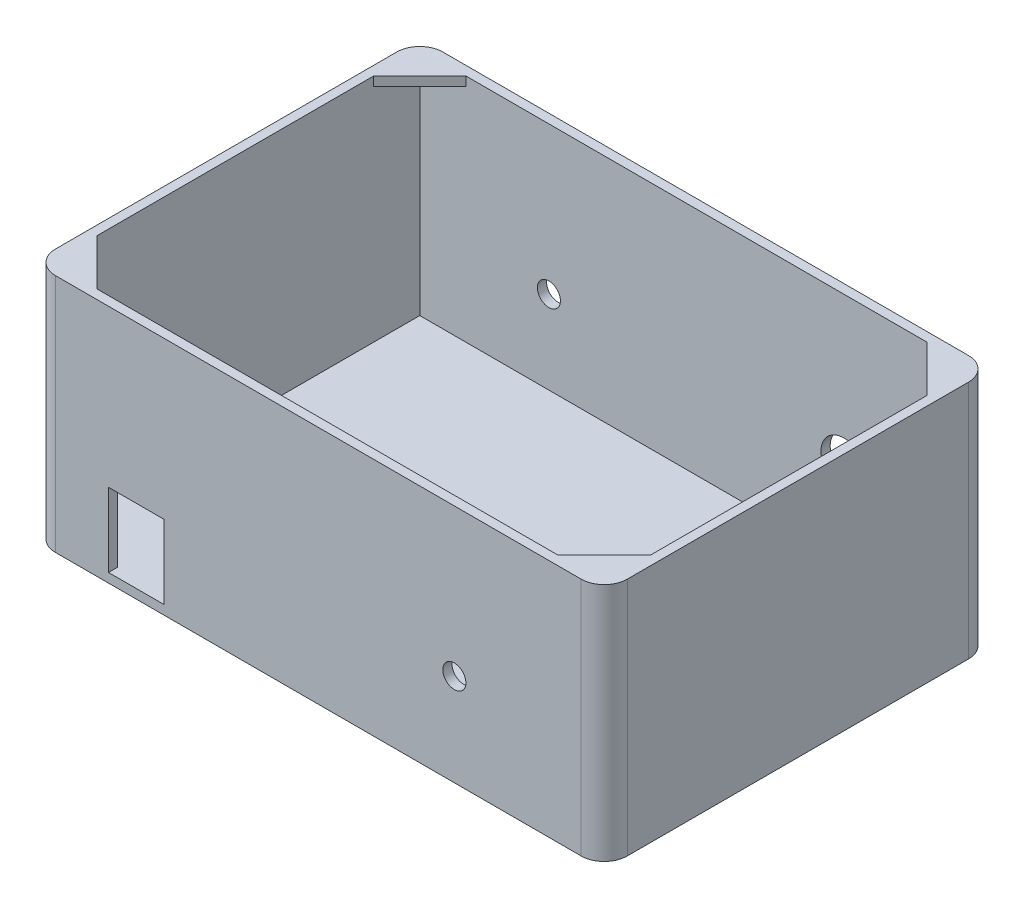
ISO-10303-21;
HEADER;
FILE_DESCRIPTION(('STEP AP214'),'2;1');
FILE_NAME('part.step','',(''),(''),'','','');
FILE_SCHEMA(('AUTOMOTIVE_DESIGN { 1 0 10303 214 1 1 1 1 }'));
ENDSEC;
DATA;
#1=APPLICATION_CONTEXT('core data for automotive mechanical design processes');
#2=APPLICATION_PROTOCOL_DEFINITION('international standard','automotive_design',2000,#1);
#3=PRODUCT_CONTEXT('',#1,'mechanical');
#4=PRODUCT('Part','Part','',(#3));
#5=PRODUCT_RELATED_PRODUCT_CATEGORY('part','',(#4));
#6=PRODUCT_DEFINITION_FORMATION('','',#4);
#7=PRODUCT_DEFINITION_CONTEXT('part definition',#1,'design');
#8=PRODUCT_DEFINITION('design','',#6,#7);
#9=PRODUCT_DEFINITION_SHAPE('','',#8);
#10=(LENGTH_UNIT() NAMED_UNIT(*) SI_UNIT(.MILLI.,.METRE.));
#11=(NAMED_UNIT(*) PLANE_ANGLE_UNIT() SI_UNIT($,.RADIAN.));
#12=(NAMED_UNIT(*) SI_UNIT($,.STERADIAN.) SOLID_ANGLE_UNIT());
#13=UNCERTAINTY_MEASURE_WITH_UNIT(LENGTH_MEASURE(1.E-05),#10,'distance_accuracy_value','');
#14=(GEOMETRIC_REPRESENTATION_CONTEXT(3) GLOBAL_UNCERTAINTY_ASSIGNED_CONTEXT((#13)) GLOBAL_UNIT_ASSIGNED_CONTEXT((#10,
#11,#12)) REPRESENTATION_CONTEXT('',''));
#15=CARTESIAN_POINT('',(0.,0.,0.));
#16=DIRECTION('',(0.,0.,1.));
#17=DIRECTION('',(1.,0.,0.));
#18=AXIS2_PLACEMENT_3D('',#15,#16,#17);
#19=CARTESIAN_POINT('',(0.,2.,0.));
#20=DIRECTION('',(0.,-1.,0.));
#21=DIRECTION('',(0.,0.,-1.));
#22=AXIS2_PLACEMENT_3D('',#19,#20,#21);
#23=PLANE('',#22);
#24=DIRECTION('',(1.,0.,0.));
#25=VECTOR('',#24,1.);
#26=CARTESIAN_POINT('',(-60.,2.,40.));
#27=LINE('',#26,#25);
#28=CARTESIAN_POINT('',(-60.,2.00000000000002,40.));
#29=VERTEX_POINT('',#28);
#30=CARTESIAN_POINT('',(-45.5,2.,40.));
#31=VERTEX_POINT('',#30);
#32=EDGE_CURVE('E398',#29,#31,#27,.T.);
#33=ORIENTED_EDGE('',*,*,#32,.T.);
#34=DIRECTION('',(0.,0.,1.));
#35=VECTOR('',#34,1.);
#36=CARTESIAN_POINT('',(-45.5,2.,40.));
#37=LINE('',#36,#35);
#38=CARTESIAN_POINT('',(-45.5,2.,42.));
#39=VERTEX_POINT('',#38);
#40=EDGE_CURVE('E213',#31,#39,#37,.T.);
#41=ORIENTED_EDGE('',*,*,#40,.T.);
#42=DIRECTION('',(1.,0.,0.));
#43=VECTOR('',#42,1.);
#44=CARTESIAN_POINT('',(-33.5,2.,42.));
#45=LINE('',#44,#43);
#46=CARTESIAN_POINT('',(-33.5,2.,42.));
#47=VERTEX_POINT('',#46);
#48=EDGE_CURVE('E307',#39,#47,#45,.T.);
#49=ORIENTED_EDGE('',*,*,#48,.T.);
#50=DIRECTION('',(0.,0.,1.));
#51=VECTOR('',#50,1.);
#52=CARTESIAN_POINT('',(-33.5,2.,40.));
#53=LINE('',#52,#51);
#54=CARTESIAN_POINT('',(-33.5,2.,40.));
#55=VERTEX_POINT('',#54);
#56=EDGE_CURVE('E324',#55,#47,#53,.T.);
#57=ORIENTED_EDGE('',*,*,#56,.F.);
#58=CARTESIAN_POINT('',(60.,2.,40.));
#59=VERTEX_POINT('',#58);
#60=EDGE_CURVE('E385',#55,#59,#27,.T.);
#61=ORIENTED_EDGE('',*,*,#60,.T.);
#62=DIRECTION('',(0.,0.,1.));
#63=VECTOR('',#62,1.);
#64=CARTESIAN_POINT('',(60.,2.,-40.));
#65=LINE('',#64,#63);
#66=CARTESIAN_POINT('',(60.,2.00000000000002,-40.));
#67=VERTEX_POINT('',#66);
#68=EDGE_CURVE('E402',#67,#59,#65,.T.);
#69=ORIENTED_EDGE('',*,*,#68,.F.);
#70=DIRECTION('',(1.,0.,0.));
#71=VECTOR('',#70,1.);
#72=CARTESIAN_POINT('',(-60.,2.,-40.));
#73=LINE('',#72,#71);
#74=CARTESIAN_POINT('',(-60.,2.00000000000002,-40.));
#75=VERTEX_POINT('',#74);
#76=EDGE_CURVE('E406',#75,#67,#73,.T.);
#77=ORIENTED_EDGE('',*,*,#76,.F.);
#78=DIRECTION('',(0.,0.,1.));
#79=VECTOR('',#78,1.);
#80=CARTESIAN_POINT('',(-60.,2.,-40.));
#81=LINE('',#80,#79);
#82=EDGE_CURVE('E410',#75,#29,#81,.T.);
#83=ORIENTED_EDGE('',*,*,#82,.T.);
#84=EDGE_LOOP('',(#33,#41,#49,#57,#61,#69,#77,#83));
#85=FACE_BOUND('',#84,.T.);
#86=ADVANCED_FACE('F39',(#85),#23,.F.);
#87=CARTESIAN_POINT('',(60.,52.,-40.));
#88=DIRECTION('',(-1.,0.,0.));
#89=DIRECTION('',(0.,0.,1.));
#90=AXIS2_PLACEMENT_3D('',#87,#88,#89);
#91=PLANE('',#90);
#92=DIRECTION('',(0.,1.,0.));
#93=VECTOR('',#92,1.);
#94=CARTESIAN_POINT('',(59.9999999999998,50.,-30.0000000000005));
#95=LINE('',#94,#93);
#96=CARTESIAN_POINT('',(60.,50.,-30.0000000000005));
#97=VERTEX_POINT('',#96);
#98=CARTESIAN_POINT('',(60.,52.,-30.0000000000005));
#99=VERTEX_POINT('',#98);
#100=EDGE_CURVE('E55',#97,#99,#95,.T.);
#101=ORIENTED_EDGE('',*,*,#100,.F.);
#102=DIRECTION('',(0.,0.,-1.));
#103=VECTOR('',#102,1.);
#104=CARTESIAN_POINT('',(59.9999999999998,50.,-30.0000000000005));
#105=LINE('',#104,#103);
#106=CARTESIAN_POINT('',(60.,50.,-40.));
#107=VERTEX_POINT('',#106);
#108=EDGE_CURVE('E698',#97,#107,#105,.T.);
#109=ORIENTED_EDGE('',*,*,#108,.T.);
#110=DIRECTION('',(0.,-1.,0.));
#111=VECTOR('',#110,1.);
#112=CARTESIAN_POINT('',(60.,52.,-40.));
#113=LINE('',#112,#111);
#114=EDGE_CURVE('E366',#107,#67,#113,.T.);
#115=ORIENTED_EDGE('',*,*,#114,.T.);
#116=ORIENTED_EDGE('',*,*,#68,.T.);
#117=DIRECTION('',(0.,-1.,0.));
#118=VECTOR('',#117,1.);
#119=CARTESIAN_POINT('',(60.,52.,40.));
#120=LINE('',#119,#118);
#121=CARTESIAN_POINT('',(60.,50.,40.));
#122=VERTEX_POINT('',#121);
#123=EDGE_CURVE('E357',#122,#59,#120,.T.);
#124=ORIENTED_EDGE('',*,*,#123,.F.);
#125=DIRECTION('',(0.,0.,-1.));
#126=VECTOR('',#125,1.);
#127=CARTESIAN_POINT('',(60.0000000000002,50.,29.9999999999996));
#128=LINE('',#127,#126);
#129=CARTESIAN_POINT('',(60.,50.,29.9999999999996));
#130=VERTEX_POINT('',#129);
#131=EDGE_CURVE('E220',#122,#130,#128,.T.);
#132=ORIENTED_EDGE('',*,*,#131,.T.);
#133=DIRECTION('',(0.,1.,0.));
#134=VECTOR('',#133,1.);
#135=CARTESIAN_POINT('',(60.0000000000002,50.,29.9999999999996));
#136=LINE('',#135,#134);
#137=CARTESIAN_POINT('',(60.0000000000002,52.,29.9999999999996));
#138=VERTEX_POINT('',#137);
#139=EDGE_CURVE('E216',#130,#138,#136,.T.);
#140=ORIENTED_EDGE('',*,*,#139,.T.);
#141=DIRECTION('',(0.,0.,-1.));
#142=VECTOR('',#141,1.);
#143=CARTESIAN_POINT('',(60.,52.,-40.));
#144=LINE('',#143,#142);
#145=EDGE_CURVE('E201',#138,#99,#144,.T.);
#146=ORIENTED_EDGE('',*,*,#145,.T.);
#147=EDGE_LOOP('',(#101,#109,#115,#116,#124,#132,#140,#146));
#148=FACE_BOUND('',#147,.T.);
#149=ADVANCED_FACE('F217',(#148),#91,.T.);
#150=CARTESIAN_POINT('',(-60.,52.,-40.));
#151=DIRECTION('',(0.,0.,1.));
#152=DIRECTION('',(1.,0.,0.));
#153=AXIS2_PLACEMENT_3D('',#150,#151,#152);
#154=PLANE('',#153);
#155=DIRECTION('',(0.,1.,0.));
#156=VECTOR('',#155,1.);
#157=CARTESIAN_POINT('',(49.9999999999997,50.,-40.0000000000005));
#158=LINE('',#157,#156);
#159=CARTESIAN_POINT('',(49.9999999999997,50.,-40.));
#160=VERTEX_POINT('',#159);
#161=CARTESIAN_POINT('',(49.9999999999997,52.,-40.));
#162=VERTEX_POINT('',#161);
#163=EDGE_CURVE('E232',#160,#162,#158,.T.);
#164=ORIENTED_EDGE('',*,*,#163,.T.);
#165=DIRECTION('',(-1.,0.,0.));
#166=VECTOR('',#165,1.);
#167=CARTESIAN_POINT('',(-60.,52.,-40.));
#168=LINE('',#167,#166);
#169=CARTESIAN_POINT('',(-50.,52.,-40.));
#170=VERTEX_POINT('',#169);
#171=EDGE_CURVE('E212',#162,#170,#168,.T.);
#172=ORIENTED_EDGE('',*,*,#171,.T.);
#173=DIRECTION('',(0.,1.,0.));
#174=VECTOR('',#173,1.);
#175=CARTESIAN_POINT('',(-50.,50.,-40.));
#176=LINE('',#175,#174);
#177=CARTESIAN_POINT('',(-50.,50.,-40.));
#178=VERTEX_POINT('',#177);
#179=EDGE_CURVE('E279',#178,#170,#176,.T.);
#180=ORIENTED_EDGE('',*,*,#179,.F.);
#181=DIRECTION('',(-1.,0.,0.));
#182=VECTOR('',#181,1.);
#183=CARTESIAN_POINT('',(-60.,50.,-40.));
#184=LINE('',#183,#182);
#185=CARTESIAN_POINT('',(-60.,50.,-40.));
#186=VERTEX_POINT('',#185);
#187=EDGE_CURVE('E265',#178,#186,#184,.T.);
#188=ORIENTED_EDGE('',*,*,#187,.T.);
#189=DIRECTION('',(0.,-1.,0.));
#190=VECTOR('',#189,1.);
#191=CARTESIAN_POINT('',(-60.,52.,-40.));
#192=LINE('',#191,#190);
#193=EDGE_CURVE('E363',#186,#75,#192,.T.);
#194=ORIENTED_EDGE('',*,*,#193,.T.);
#195=ORIENTED_EDGE('',*,*,#76,.T.);
#196=ORIENTED_EDGE('',*,*,#114,.F.);
#197=DIRECTION('',(-1.,0.,0.));
#198=VECTOR('',#197,1.);
#199=CARTESIAN_POINT('',(59.9999999999997,50.,-40.0000000000005));
#200=LINE('',#199,#198);
#201=EDGE_CURVE('E63',#107,#160,#200,.T.);
#202=ORIENTED_EDGE('',*,*,#201,.T.);
#203=EDGE_LOOP('',(#164,#172,#180,#188,#194,#195,#196,#202));
#204=FACE_BOUND('',#203,.T.);
#205=CARTESIAN_POINT('',(32.,20.,-40.));
#206=DIRECTION('',(0.,0.,-1.));
#207=DIRECTION('',(-1.,0.,0.));
#208=AXIS2_PLACEMENT_3D('',#205,#206,#207);
#209=CIRCLE('',#208,5.);
#210=CARTESIAN_POINT('',(27.,20.,-40.));
#211=VERTEX_POINT('',#210);
#212=EDGE_CURVE('E287',#211,#211,#209,.T.);
#213=ORIENTED_EDGE('',*,*,#212,.T.);
#214=EDGE_LOOP('',(#213));
#215=FACE_BOUND('',#214,.T.);
#216=CARTESIAN_POINT('',(-32.,20.,-40.));
#217=DIRECTION('',(0.,0.,-1.));
#218=DIRECTION('',(-1.,0.,0.));
#219=AXIS2_PLACEMENT_3D('',#216,#217,#218);
#220=CIRCLE('',#219,2.5);
#221=CARTESIAN_POINT('',(-34.5,20.,-40.));
#222=VERTEX_POINT('',#221);
#223=EDGE_CURVE('E296',#222,#222,#220,.T.);
#224=ORIENTED_EDGE('',*,*,#223,.T.);
#225=EDGE_LOOP('',(#224));
#226=FACE_BOUND('',#225,.T.);
#227=ADVANCED_FACE('F515',(#204,#215,#226),#154,.T.);
#228=CARTESIAN_POINT('',(-60.,52.,-40.));
#229=DIRECTION('',(1.,0.,0.));
#230=DIRECTION('',(0.,0.,-1.));
#231=AXIS2_PLACEMENT_3D('',#228,#229,#230);
#232=PLANE('',#231);
#233=DIRECTION('',(0.,1.,0.));
#234=VECTOR('',#233,1.);
#235=CARTESIAN_POINT('',(-60.,50.,30.));
#236=LINE('',#235,#234);
#237=CARTESIAN_POINT('',(-60.,50.,30.));
#238=VERTEX_POINT('',#237);
#239=CARTESIAN_POINT('',(-60.,52.,30.));
#240=VERTEX_POINT('',#239);
#241=EDGE_CURVE('E254',#238,#240,#236,.T.);
#242=ORIENTED_EDGE('',*,*,#241,.F.);
#243=DIRECTION('',(0.,0.,1.));
#244=VECTOR('',#243,1.);
#245=CARTESIAN_POINT('',(-60.,50.,30.));
#246=LINE('',#245,#244);
#247=CARTESIAN_POINT('',(-60.,50.,40.));
#248=VERTEX_POINT('',#247);
#249=EDGE_CURVE('E248',#238,#248,#246,.T.);
#250=ORIENTED_EDGE('',*,*,#249,.T.);
#251=DIRECTION('',(0.,-1.,0.));
#252=VECTOR('',#251,1.);
#253=CARTESIAN_POINT('',(-60.,52.,40.));
#254=LINE('',#253,#252);
#255=EDGE_CURVE('E360',#248,#29,#254,.T.);
#256=ORIENTED_EDGE('',*,*,#255,.T.);
#257=ORIENTED_EDGE('',*,*,#82,.F.);
#258=ORIENTED_EDGE('',*,*,#193,.F.);
#259=DIRECTION('',(0.,0.,1.));
#260=VECTOR('',#259,1.);
#261=CARTESIAN_POINT('',(-60.,50.,-30.));
#262=LINE('',#261,#260);
#263=CARTESIAN_POINT('',(-60.,50.,-30.));
#264=VERTEX_POINT('',#263);
#265=EDGE_CURVE('E268',#186,#264,#262,.T.);
#266=ORIENTED_EDGE('',*,*,#265,.T.);
#267=DIRECTION('',(0.,1.,0.));
#268=VECTOR('',#267,1.);
#269=CARTESIAN_POINT('',(-60.,50.,-30.));
#270=LINE('',#269,#268);
#271=CARTESIAN_POINT('',(-60.,52.,-30.));
#272=VERTEX_POINT('',#271);
#273=EDGE_CURVE('E275',#264,#272,#270,.T.);
#274=ORIENTED_EDGE('',*,*,#273,.T.);
#275=DIRECTION('',(0.,0.,1.));
#276=VECTOR('',#275,1.);
#277=CARTESIAN_POINT('',(-60.,52.,-40.));
#278=LINE('',#277,#276);
#279=EDGE_CURVE('E351',#272,#240,#278,.T.);
#280=ORIENTED_EDGE('',*,*,#279,.T.);
#281=EDGE_LOOP('',(#242,#250,#256,#257,#258,#266,#274,#280));
#282=FACE_BOUND('',#281,.T.);
#283=ADVANCED_FACE('F560',(#282),#232,.T.);
#284=CARTESIAN_POINT('',(-60.,52.,40.));
#285=DIRECTION('',(0.,0.,-1.));
#286=DIRECTION('',(-1.,0.,0.));
#287=AXIS2_PLACEMENT_3D('',#284,#285,#286);
#288=PLANE('',#287);
#289=DIRECTION('',(0.,1.,0.));
#290=VECTOR('',#289,1.);
#291=CARTESIAN_POINT('',(50.0000000000003,50.,39.9999999999996));
#292=LINE('',#291,#290);
#293=CARTESIAN_POINT('',(50.0000000000003,50.,40.));
#294=VERTEX_POINT('',#293);
#295=CARTESIAN_POINT('',(49.9999999999999,52.,40.));
#296=VERTEX_POINT('',#295);
#297=EDGE_CURVE('E225',#294,#296,#292,.T.);
#298=ORIENTED_EDGE('',*,*,#297,.F.);
#299=DIRECTION('',(1.,0.,0.));
#300=VECTOR('',#299,1.);
#301=CARTESIAN_POINT('',(60.0000000000003,50.,39.9999999999996));
#302=LINE('',#301,#300);
#303=EDGE_CURVE('E231',#294,#122,#302,.T.);
#304=ORIENTED_EDGE('',*,*,#303,.T.);
#305=ORIENTED_EDGE('',*,*,#123,.T.);
#306=ORIENTED_EDGE('',*,*,#60,.F.);
#307=DIRECTION('',(0.,1.,0.));
#308=VECTOR('',#307,1.);
#309=CARTESIAN_POINT('',(-33.5,18.,40.));
#310=LINE('',#309,#308);
#311=CARTESIAN_POINT('',(-33.5,18.,40.));
#312=VERTEX_POINT('',#311);
#313=EDGE_CURVE('E311',#55,#312,#310,.T.);
#314=ORIENTED_EDGE('',*,*,#313,.T.);
#315=DIRECTION('',(-1.,0.,0.));
#316=VECTOR('',#315,1.);
#317=CARTESIAN_POINT('',(-45.5,18.,40.));
#318=LINE('',#317,#316);
#319=CARTESIAN_POINT('',(-45.5,18.,40.));
#320=VERTEX_POINT('',#319);
#321=EDGE_CURVE('E315',#312,#320,#318,.T.);
#322=ORIENTED_EDGE('',*,*,#321,.T.);
#323=DIRECTION('',(0.,-1.,0.));
#324=VECTOR('',#323,1.);
#325=CARTESIAN_POINT('',(-45.5,2.,40.));
#326=LINE('',#325,#324);
#327=EDGE_CURVE('E320',#320,#31,#326,.T.);
#328=ORIENTED_EDGE('',*,*,#327,.T.);
#329=ORIENTED_EDGE('',*,*,#32,.F.);
#330=ORIENTED_EDGE('',*,*,#255,.F.);
#331=DIRECTION('',(1.,0.,0.));
#332=VECTOR('',#331,1.);
#333=CARTESIAN_POINT('',(-60.,50.,40.));
#334=LINE('',#333,#332);
#335=CARTESIAN_POINT('',(-50.,50.,40.));
#336=VERTEX_POINT('',#335);
#337=EDGE_CURVE('E251',#248,#336,#334,.T.);
#338=ORIENTED_EDGE('',*,*,#337,.T.);
#339=DIRECTION('',(0.,1.,0.));
#340=VECTOR('',#339,1.);
#341=CARTESIAN_POINT('',(-50.,50.,40.));
#342=LINE('',#341,#340);
#343=CARTESIAN_POINT('',(-50.,52.,40.));
#344=VERTEX_POINT('',#343);
#345=EDGE_CURVE('E258',#336,#344,#342,.T.);
#346=ORIENTED_EDGE('',*,*,#345,.T.);
#347=DIRECTION('',(1.,0.,0.));
#348=VECTOR('',#347,1.);
#349=CARTESIAN_POINT('',(-60.,52.,40.));
#350=LINE('',#349,#348);
#351=EDGE_CURVE('E354',#344,#296,#350,.T.);
#352=ORIENTED_EDGE('',*,*,#351,.T.);
#353=EDGE_LOOP('',(#298,#304,#305,#306,#314,#322,#328,#329,#330,#338,#346,#352));
#354=FACE_BOUND('',#353,.T.);
#355=CARTESIAN_POINT('',(29.5,20.,40.));
#356=DIRECTION('',(0.,0.,1.));
#357=DIRECTION('',(1.,0.,0.));
#358=AXIS2_PLACEMENT_3D('',#355,#356,#357);
#359=CIRCLE('',#358,2.5);
#360=CARTESIAN_POINT('',(32.,20.,40.));
#361=VERTEX_POINT('',#360);
#362=EDGE_CURVE('E303',#361,#361,#359,.T.);
#363=ORIENTED_EDGE('',*,*,#362,.T.);
#364=EDGE_LOOP('',(#363));
#365=FACE_BOUND('',#364,.T.);
#366=ADVANCED_FACE('F557',(#354,#365),#288,.T.);
#367=CARTESIAN_POINT('',(0.,52.,0.));
#368=DIRECTION('',(0.,-1.,0.));
#369=DIRECTION('',(0.,0.,-1.));
#370=AXIS2_PLACEMENT_3D('',#367,#368,#369);
#371=PLANE('',#370);
#372=ORIENTED_EDGE('',*,*,#171,.F.);
#373=DIRECTION('',(0.70710678118655,0.,0.707106781186545));
#374=VECTOR('',#373,1.);
#375=CARTESIAN_POINT('',(49.9999999999997,52.,-40.0000000000005));
#376=LINE('',#375,#374);
#377=EDGE_CURVE('E210',#162,#99,#376,.T.);
#378=ORIENTED_EDGE('',*,*,#377,.T.);
#379=ORIENTED_EDGE('',*,*,#145,.F.);
#380=DIRECTION('',(-0.707106781186545,0.,0.70710678118655));
#381=VECTOR('',#380,1.);
#382=CARTESIAN_POINT('',(50.0000000000003,52.,39.9999999999996));
#383=LINE('',#382,#381);
#384=EDGE_CURVE('E208',#138,#296,#383,.T.);
#385=ORIENTED_EDGE('',*,*,#384,.T.);
#386=ORIENTED_EDGE('',*,*,#351,.F.);
#387=DIRECTION('',(-0.707106781186548,0.,-0.707106781186548));
#388=VECTOR('',#387,1.);
#389=CARTESIAN_POINT('',(-50.,52.,40.));
#390=LINE('',#389,#388);
#391=EDGE_CURVE('E242',#344,#240,#390,.T.);
#392=ORIENTED_EDGE('',*,*,#391,.T.);
#393=ORIENTED_EDGE('',*,*,#279,.F.);
#394=DIRECTION('',(0.707106781186548,0.,-0.707106781186548));
#395=VECTOR('',#394,1.);
#396=CARTESIAN_POINT('',(-50.,52.,-40.));
#397=LINE('',#396,#395);
#398=EDGE_CURVE('E261',#272,#170,#397,.T.);
#399=ORIENTED_EDGE('',*,*,#398,.T.);
#400=EDGE_LOOP('',(#372,#378,#379,#385,#386,#392,#393,#399));
#401=FACE_BOUND('',#400,.T.);
#402=DIRECTION('',(0.,0.,1.));
#403=VECTOR('',#402,1.);
#404=CARTESIAN_POINT('',(-62.,52.,-42.));
#405=LINE('',#404,#403);
#406=CARTESIAN_POINT('',(-62.,52.,-37.));
#407=VERTEX_POINT('',#406);
#408=CARTESIAN_POINT('',(-62.,52.,37.));
#409=VERTEX_POINT('',#408);
#410=EDGE_CURVE('E374',#407,#409,#405,.T.);
#411=ORIENTED_EDGE('',*,*,#410,.T.);
#412=CARTESIAN_POINT('',(-57.,52.,37.));
#413=DIRECTION('',(0.,-1.,0.));
#414=DIRECTION('',(0.,0.,-1.));
#415=AXIS2_PLACEMENT_3D('',#412,#413,#414);
#416=CIRCLE('',#415,5.);
#417=CARTESIAN_POINT('',(-57.,52.,42.));
#418=VERTEX_POINT('',#417);
#419=EDGE_CURVE('E11',#409,#418,#416,.F.);
#420=ORIENTED_EDGE('',*,*,#419,.T.);
#421=DIRECTION('',(1.,0.,0.));
#422=VECTOR('',#421,1.);
#423=CARTESIAN_POINT('',(-62.,52.,42.));
#424=LINE('',#423,#422);
#425=CARTESIAN_POINT('',(57.,52.,42.));
#426=VERTEX_POINT('',#425);
#427=EDGE_CURVE('E379',#418,#426,#424,.T.);
#428=ORIENTED_EDGE('',*,*,#427,.T.);
#429=CARTESIAN_POINT('',(57.,52.,37.));
#430=DIRECTION('',(0.,-1.,0.));
#431=DIRECTION('',(0.,0.,-1.));
#432=AXIS2_PLACEMENT_3D('',#429,#430,#431);
#433=CIRCLE('',#432,5.);
#434=CARTESIAN_POINT('',(62.,52.,37.));
#435=VERTEX_POINT('',#434);
#436=EDGE_CURVE('E441',#426,#435,#433,.F.);
#437=ORIENTED_EDGE('',*,*,#436,.T.);
#438=DIRECTION('',(0.,0.,-1.));
#439=VECTOR('',#438,1.);
#440=CARTESIAN_POINT('',(62.,52.,-42.));
#441=LINE('',#440,#439);
#442=CARTESIAN_POINT('',(62.,52.,-37.));
#443=VERTEX_POINT('',#442);
#444=EDGE_CURVE('E382',#435,#443,#441,.T.);
#445=ORIENTED_EDGE('',*,*,#444,.T.);
#446=CARTESIAN_POINT('',(57.,52.,-37.));
#447=DIRECTION('',(0.,-1.,0.));
#448=DIRECTION('',(0.,0.,-1.));
#449=AXIS2_PLACEMENT_3D('',#446,#447,#448);
#450=CIRCLE('',#449,5.);
#451=CARTESIAN_POINT('',(57.,52.,-42.));
#452=VERTEX_POINT('',#451);
#453=EDGE_CURVE('E426',#443,#452,#450,.F.);
#454=ORIENTED_EDGE('',*,*,#453,.T.);
#455=DIRECTION('',(-1.,0.,0.));
#456=VECTOR('',#455,1.);
#457=CARTESIAN_POINT('',(-62.,52.,-42.));
#458=LINE('',#457,#456);
#459=CARTESIAN_POINT('',(-57.,52.,-42.));
#460=VERTEX_POINT('',#459);
#461=EDGE_CURVE('E370',#452,#460,#458,.T.);
#462=ORIENTED_EDGE('',*,*,#461,.T.);
#463=CARTESIAN_POINT('',(-57.,52.,-37.));
#464=DIRECTION('',(0.,-1.,0.));
#465=DIRECTION('',(0.,0.,-1.));
#466=AXIS2_PLACEMENT_3D('',#463,#464,#465);
#467=CIRCLE('',#466,5.);
#468=EDGE_CURVE('E454',#460,#407,#467,.F.);
#469=ORIENTED_EDGE('',*,*,#468,.T.);
#470=EDGE_LOOP('',(#411,#420,#428,#437,#445,#454,#462,#469));
#471=FACE_BOUND('',#470,.T.);
#472=ADVANCED_FACE('F204',(#401,#471),#371,.F.);
#473=CARTESIAN_POINT('',(-62.,52.,-42.));
#474=DIRECTION('',(0.,0.,1.));
#475=DIRECTION('',(1.,0.,0.));
#476=AXIS2_PLACEMENT_3D('',#473,#474,#475);
#477=PLANE('',#476);
#478=CARTESIAN_POINT('',(32.,20.,-42.));
#479=DIRECTION('',(0.,0.,-1.));
#480=DIRECTION('',(-1.,0.,0.));
#481=AXIS2_PLACEMENT_3D('',#478,#479,#480);
#482=CIRCLE('',#481,5.);
#483=CARTESIAN_POINT('',(27.,20.,-42.));
#484=VERTEX_POINT('',#483);
#485=EDGE_CURVE('E292',#484,#484,#482,.T.);
#486=ORIENTED_EDGE('',*,*,#485,.F.);
#487=EDGE_LOOP('',(#486));
#488=FACE_BOUND('',#487,.T.);
#489=CARTESIAN_POINT('',(-32.,20.,-42.));
#490=DIRECTION('',(0.,0.,-1.));
#491=DIRECTION('',(-1.,0.,0.));
#492=AXIS2_PLACEMENT_3D('',#489,#490,#491);
#493=CIRCLE('',#492,2.5);
#494=CARTESIAN_POINT('',(-34.5,20.,-42.));
#495=VERTEX_POINT('',#494);
#496=EDGE_CURVE('E283',#495,#495,#493,.T.);
#497=ORIENTED_EDGE('',*,*,#496,.F.);
#498=EDGE_LOOP('',(#497));
#499=FACE_BOUND('',#498,.T.);
#500=DIRECTION('',(-1.,0.,0.));
#501=VECTOR('',#500,1.);
#502=CARTESIAN_POINT('',(-62.,0.,-42.));
#503=LINE('',#502,#501);
#504=CARTESIAN_POINT('',(57.,0.,-42.));
#505=VERTEX_POINT('',#504);
#506=CARTESIAN_POINT('',(-57.,0.,-42.));
#507=VERTEX_POINT('',#506);
#508=EDGE_CURVE('E369',#505,#507,#503,.T.);
#509=ORIENTED_EDGE('',*,*,#508,.T.);
#510=DIRECTION('',(0.,-1.,0.));
#511=VECTOR('',#510,1.);
#512=CARTESIAN_POINT('',(-57.,52.,-42.));
#513=LINE('',#512,#511);
#514=EDGE_CURVE('E451',#507,#460,#513,.F.);
#515=ORIENTED_EDGE('',*,*,#514,.T.);
#516=ORIENTED_EDGE('',*,*,#461,.F.);
#517=DIRECTION('',(0.,-1.,0.));
#518=VECTOR('',#517,1.);
#519=CARTESIAN_POINT('',(57.,52.,-42.));
#520=LINE('',#519,#518);
#521=EDGE_CURVE('E414',#452,#505,#520,.T.);
#522=ORIENTED_EDGE('',*,*,#521,.T.);
#523=EDGE_LOOP('',(#509,#515,#516,#522));
#524=FACE_BOUND('',#523,.T.);
#525=ADVANCED_FACE('F496',(#488,#499,#524),#477,.F.);
#526=CARTESIAN_POINT('',(-62.,52.,-42.));
#527=DIRECTION('',(1.,0.,0.));
#528=DIRECTION('',(0.,0.,-1.));
#529=AXIS2_PLACEMENT_3D('',#526,#527,#528);
#530=PLANE('',#529);
#531=DIRECTION('',(0.,0.,1.));
#532=VECTOR('',#531,1.);
#533=CARTESIAN_POINT('',(-62.,0.,-42.));
#534=LINE('',#533,#532);
#535=CARTESIAN_POINT('',(-62.,0.,-37.));
#536=VERTEX_POINT('',#535);
#537=CARTESIAN_POINT('',(-62.,0.,37.));
#538=VERTEX_POINT('',#537);
#539=EDGE_CURVE('E389',#536,#538,#534,.T.);
#540=ORIENTED_EDGE('',*,*,#539,.T.);
#541=DIRECTION('',(0.,-1.,0.));
#542=VECTOR('',#541,1.);
#543=CARTESIAN_POINT('',(-62.,52.,37.));
#544=LINE('',#543,#542);
#545=EDGE_CURVE('E48',#538,#409,#544,.F.);
#546=ORIENTED_EDGE('',*,*,#545,.T.);
#547=ORIENTED_EDGE('',*,*,#410,.F.);
#548=DIRECTION('',(0.,-1.,0.));
#549=VECTOR('',#548,1.);
#550=CARTESIAN_POINT('',(-62.,52.,-37.));
#551=LINE('',#550,#549);
#552=EDGE_CURVE('E444',#407,#536,#551,.T.);
#553=ORIENTED_EDGE('',*,*,#552,.T.);
#554=EDGE_LOOP('',(#540,#546,#547,#553));
#555=FACE_BOUND('',#554,.T.);
#556=ADVANCED_FACE('F467',(#555),#530,.F.);
#557=CARTESIAN_POINT('',(-62.,52.,42.));
#558=DIRECTION('',(0.,0.,-1.));
#559=DIRECTION('',(-1.,0.,0.));
#560=AXIS2_PLACEMENT_3D('',#557,#558,#559);
#561=PLANE('',#560);
#562=CARTESIAN_POINT('',(29.5,20.,42.));
#563=DIRECTION('',(0.,0.,1.));
#564=DIRECTION('',(1.,0.,0.));
#565=AXIS2_PLACEMENT_3D('',#562,#563,#564);
#566=CIRCLE('',#565,2.5);
#567=CARTESIAN_POINT('',(32.,20.,42.));
#568=VERTEX_POINT('',#567);
#569=EDGE_CURVE('E291',#568,#568,#566,.T.);
#570=ORIENTED_EDGE('',*,*,#569,.F.);
#571=EDGE_LOOP('',(#570));
#572=FACE_BOUND('',#571,.T.);
#573=DIRECTION('',(0.,1.,0.));
#574=VECTOR('',#573,1.);
#575=CARTESIAN_POINT('',(-33.5,18.,42.));
#576=LINE('',#575,#574);
#577=CARTESIAN_POINT('',(-33.5,18.,42.));
#578=VERTEX_POINT('',#577);
#579=EDGE_CURVE('E327',#47,#578,#576,.T.);
#580=ORIENTED_EDGE('',*,*,#579,.F.);
#581=ORIENTED_EDGE('',*,*,#48,.F.);
#582=DIRECTION('',(0.,-1.,0.));
#583=VECTOR('',#582,1.);
#584=CARTESIAN_POINT('',(-45.5,2.,42.));
#585=LINE('',#584,#583);
#586=CARTESIAN_POINT('',(-45.5,18.,42.));
#587=VERTEX_POINT('',#586);
#588=EDGE_CURVE('E316',#587,#39,#585,.T.);
#589=ORIENTED_EDGE('',*,*,#588,.F.);
#590=DIRECTION('',(-1.,0.,0.));
#591=VECTOR('',#590,1.);
#592=CARTESIAN_POINT('',(-45.5,18.,42.));
#593=LINE('',#592,#591);
#594=EDGE_CURVE('E331',#578,#587,#593,.T.);
#595=ORIENTED_EDGE('',*,*,#594,.F.);
#596=EDGE_LOOP('',(#580,#581,#589,#595));
#597=FACE_BOUND('',#596,.T.);
#598=ORIENTED_EDGE('',*,*,#427,.F.);
#599=DIRECTION('',(0.,-1.,0.));
#600=VECTOR('',#599,1.);
#601=CARTESIAN_POINT('',(-57.,52.,42.));
#602=LINE('',#601,#600);
#603=CARTESIAN_POINT('',(-57.,0.,42.));
#604=VERTEX_POINT('',#603);
#605=EDGE_CURVE('E457',#418,#604,#602,.T.);
#606=ORIENTED_EDGE('',*,*,#605,.T.);
#607=DIRECTION('',(1.,0.,0.));
#608=VECTOR('',#607,1.);
#609=CARTESIAN_POINT('',(-62.,0.,42.));
#610=LINE('',#609,#608);
#611=CARTESIAN_POINT('',(57.,0.,42.));
#612=VERTEX_POINT('',#611);
#613=EDGE_CURVE('E393',#604,#612,#610,.T.);
#614=ORIENTED_EDGE('',*,*,#613,.T.);
#615=DIRECTION('',(0.,-1.,0.));
#616=VECTOR('',#615,1.);
#617=CARTESIAN_POINT('',(57.,52.,42.));
#618=LINE('',#617,#616);
#619=EDGE_CURVE('E437',#612,#426,#618,.F.);
#620=ORIENTED_EDGE('',*,*,#619,.T.);
#621=EDGE_LOOP('',(#598,#606,#614,#620));
#622=FACE_BOUND('',#621,.T.);
#623=ADVANCED_FACE('F477',(#572,#597,#622),#561,.F.);
#624=CARTESIAN_POINT('',(62.,52.,-42.));
#625=DIRECTION('',(-1.,0.,0.));
#626=DIRECTION('',(0.,0.,1.));
#627=AXIS2_PLACEMENT_3D('',#624,#625,#626);
#628=PLANE('',#627);
#629=ORIENTED_EDGE('',*,*,#444,.F.);
#630=DIRECTION('',(0.,-1.,0.));
#631=VECTOR('',#630,1.);
#632=CARTESIAN_POINT('',(62.,52.,37.));
#633=LINE('',#632,#631);
#634=CARTESIAN_POINT('',(62.,0.,37.));
#635=VERTEX_POINT('',#634);
#636=EDGE_CURVE('E429',#435,#635,#633,.T.);
#637=ORIENTED_EDGE('',*,*,#636,.T.);
#638=DIRECTION('',(0.,0.,-1.));
#639=VECTOR('',#638,1.);
#640=CARTESIAN_POINT('',(62.,0.,-42.));
#641=LINE('',#640,#639);
#642=CARTESIAN_POINT('',(62.,0.,-37.));
#643=VERTEX_POINT('',#642);
#644=EDGE_CURVE('E375',#635,#643,#641,.T.);
#645=ORIENTED_EDGE('',*,*,#644,.T.);
#646=DIRECTION('',(0.,-1.,0.));
#647=VECTOR('',#646,1.);
#648=CARTESIAN_POINT('',(62.,52.,-37.));
#649=LINE('',#648,#647);
#650=EDGE_CURVE('E422',#643,#443,#649,.F.);
#651=ORIENTED_EDGE('',*,*,#650,.T.);
#652=EDGE_LOOP('',(#629,#637,#645,#651));
#653=FACE_BOUND('',#652,.T.);
#654=ADVANCED_FACE('F488',(#653),#628,.F.);
#655=CARTESIAN_POINT('',(0.,0.,0.));
#656=DIRECTION('',(0.,-1.,0.));
#657=DIRECTION('',(0.,0.,-1.));
#658=AXIS2_PLACEMENT_3D('',#655,#656,#657);
#659=PLANE('',#658);
#660=ORIENTED_EDGE('',*,*,#613,.F.);
#661=CARTESIAN_POINT('',(-57.,0.,37.));
#662=DIRECTION('',(0.,-1.,0.));
#663=DIRECTION('',(0.,0.,-1.));
#664=AXIS2_PLACEMENT_3D('',#661,#662,#663);
#665=CIRCLE('',#664,5.);
#666=EDGE_CURVE('E461',#604,#538,#665,.T.);
#667=ORIENTED_EDGE('',*,*,#666,.T.);
#668=ORIENTED_EDGE('',*,*,#539,.F.);
#669=CARTESIAN_POINT('',(-57.,0.,-37.));
#670=DIRECTION('',(0.,-1.,0.));
#671=DIRECTION('',(0.,0.,-1.));
#672=AXIS2_PLACEMENT_3D('',#669,#670,#671);
#673=CIRCLE('',#672,5.);
#674=EDGE_CURVE('E448',#536,#507,#673,.T.);
#675=ORIENTED_EDGE('',*,*,#674,.T.);
#676=ORIENTED_EDGE('',*,*,#508,.F.);
#677=CARTESIAN_POINT('',(57.,0.,-37.));
#678=DIRECTION('',(0.,-1.,0.));
#679=DIRECTION('',(0.,0.,-1.));
#680=AXIS2_PLACEMENT_3D('',#677,#678,#679);
#681=CIRCLE('',#680,5.);
#682=EDGE_CURVE('E418',#505,#643,#681,.T.);
#683=ORIENTED_EDGE('',*,*,#682,.T.);
#684=ORIENTED_EDGE('',*,*,#644,.F.);
#685=CARTESIAN_POINT('',(57.,0.,37.));
#686=DIRECTION('',(0.,-1.,0.));
#687=DIRECTION('',(0.,0.,-1.));
#688=AXIS2_PLACEMENT_3D('',#685,#686,#687);
#689=CIRCLE('',#688,5.);
#690=EDGE_CURVE('E433',#635,#612,#689,.T.);
#691=ORIENTED_EDGE('',*,*,#690,.T.);
#692=EDGE_LOOP('',(#660,#667,#668,#675,#676,#683,#684,#691));
#693=FACE_BOUND('',#692,.T.);
#694=ADVANCED_FACE('F479',(#693),#659,.T.);
#695=CARTESIAN_POINT('',(-45.5,2.,40.));
#696=DIRECTION('',(-1.,0.,0.));
#697=DIRECTION('',(0.,0.,1.));
#698=AXIS2_PLACEMENT_3D('',#695,#696,#697);
#699=PLANE('',#698);
#700=ORIENTED_EDGE('',*,*,#588,.T.);
#701=ORIENTED_EDGE('',*,*,#40,.F.);
#702=ORIENTED_EDGE('',*,*,#327,.F.);
#703=DIRECTION('',(0.,0.,1.));
#704=VECTOR('',#703,1.);
#705=CARTESIAN_POINT('',(-45.5,18.,40.));
#706=LINE('',#705,#704);
#707=EDGE_CURVE('E340',#320,#587,#706,.T.);
#708=ORIENTED_EDGE('',*,*,#707,.T.);
#709=EDGE_LOOP('',(#700,#701,#702,#708));
#710=FACE_BOUND('',#709,.T.);
#711=ADVANCED_FACE('F522',(#710),#699,.F.);
#712=CARTESIAN_POINT('',(-45.5,18.,40.));
#713=DIRECTION('',(0.,1.,0.));
#714=DIRECTION('',(0.,0.,1.));
#715=AXIS2_PLACEMENT_3D('',#712,#713,#714);
#716=PLANE('',#715);
#717=ORIENTED_EDGE('',*,*,#594,.T.);
#718=ORIENTED_EDGE('',*,*,#707,.F.);
#719=ORIENTED_EDGE('',*,*,#321,.F.);
#720=DIRECTION('',(0.,0.,1.));
#721=VECTOR('',#720,1.);
#722=CARTESIAN_POINT('',(-33.5,18.,40.));
#723=LINE('',#722,#721);
#724=EDGE_CURVE('E343',#312,#578,#723,.T.);
#725=ORIENTED_EDGE('',*,*,#724,.T.);
#726=EDGE_LOOP('',(#717,#718,#719,#725));
#727=FACE_BOUND('',#726,.T.);
#728=ADVANCED_FACE('F549',(#727),#716,.F.);
#729=CARTESIAN_POINT('',(-33.5,18.,40.));
#730=DIRECTION('',(1.,0.,0.));
#731=DIRECTION('',(0.,1.,0.));
#732=AXIS2_PLACEMENT_3D('',#729,#730,#731);
#733=PLANE('',#732);
#734=ORIENTED_EDGE('',*,*,#579,.T.);
#735=ORIENTED_EDGE('',*,*,#724,.F.);
#736=ORIENTED_EDGE('',*,*,#313,.F.);
#737=ORIENTED_EDGE('',*,*,#56,.T.);
#738=EDGE_LOOP('',(#734,#735,#736,#737));
#739=FACE_BOUND('',#738,.T.);
#740=ADVANCED_FACE('F545',(#739),#733,.F.);
#741=CARTESIAN_POINT('',(29.5,20.,40.));
#742=DIRECTION('',(0.,0.,1.));
#743=DIRECTION('',(1.,0.,0.));
#744=AXIS2_PLACEMENT_3D('',#741,#742,#743);
#745=CYLINDRICAL_SURFACE('',#744,2.5);
#746=ORIENTED_EDGE('',*,*,#362,.F.);
#747=EDGE_LOOP('',(#746));
#748=FACE_BOUND('',#747,.T.);
#749=ORIENTED_EDGE('',*,*,#569,.T.);
#750=EDGE_LOOP('',(#749));
#751=FACE_BOUND('',#750,.T.);
#752=ADVANCED_FACE('F535',(#748,#751),#745,.F.);
#753=CARTESIAN_POINT('',(-32.,20.,-40.));
#754=DIRECTION('',(0.,0.,-1.));
#755=DIRECTION('',(-1.,0.,0.));
#756=AXIS2_PLACEMENT_3D('',#753,#754,#755);
#757=CYLINDRICAL_SURFACE('',#756,2.5);
#758=ORIENTED_EDGE('',*,*,#223,.F.);
#759=EDGE_LOOP('',(#758));
#760=FACE_BOUND('',#759,.T.);
#761=ORIENTED_EDGE('',*,*,#496,.T.);
#762=EDGE_LOOP('',(#761));
#763=FACE_BOUND('',#762,.T.);
#764=ADVANCED_FACE('F529',(#760,#763),#757,.F.);
#765=CARTESIAN_POINT('',(32.,20.,-40.));
#766=DIRECTION('',(0.,0.,-1.));
#767=DIRECTION('',(-1.,0.,0.));
#768=AXIS2_PLACEMENT_3D('',#765,#766,#767);
#769=CYLINDRICAL_SURFACE('',#768,5.);
#770=ORIENTED_EDGE('',*,*,#212,.F.);
#771=EDGE_LOOP('',(#770));
#772=FACE_BOUND('',#771,.T.);
#773=ORIENTED_EDGE('',*,*,#485,.T.);
#774=EDGE_LOOP('',(#773));
#775=FACE_BOUND('',#774,.T.);
#776=ADVANCED_FACE('F524',(#772,#775),#769,.F.);
#777=CARTESIAN_POINT('',(57.,52.,-37.));
#778=DIRECTION('',(0.,-1.,0.));
#779=DIRECTION('',(0.,0.,-1.));
#780=AXIS2_PLACEMENT_3D('',#777,#778,#779);
#781=CYLINDRICAL_SURFACE('',#780,5.);
#782=ORIENTED_EDGE('',*,*,#453,.F.);
#783=ORIENTED_EDGE('',*,*,#650,.F.);
#784=ORIENTED_EDGE('',*,*,#682,.F.);
#785=ORIENTED_EDGE('',*,*,#521,.F.);
#786=EDGE_LOOP('',(#782,#783,#784,#785));
#787=FACE_BOUND('',#786,.T.);
#788=ADVANCED_FACE('F493',(#787),#781,.T.);
#789=CARTESIAN_POINT('',(57.,52.,37.));
#790=DIRECTION('',(0.,-1.,0.));
#791=DIRECTION('',(0.,0.,-1.));
#792=AXIS2_PLACEMENT_3D('',#789,#790,#791);
#793=CYLINDRICAL_SURFACE('',#792,5.);
#794=ORIENTED_EDGE('',*,*,#436,.F.);
#795=ORIENTED_EDGE('',*,*,#619,.F.);
#796=ORIENTED_EDGE('',*,*,#690,.F.);
#797=ORIENTED_EDGE('',*,*,#636,.F.);
#798=EDGE_LOOP('',(#794,#795,#796,#797));
#799=FACE_BOUND('',#798,.T.);
#800=ADVANCED_FACE('F485',(#799),#793,.T.);
#801=CARTESIAN_POINT('',(-57.,52.,-37.));
#802=DIRECTION('',(0.,-1.,0.));
#803=DIRECTION('',(0.,0.,-1.));
#804=AXIS2_PLACEMENT_3D('',#801,#802,#803);
#805=CYLINDRICAL_SURFACE('',#804,5.);
#806=ORIENTED_EDGE('',*,*,#468,.F.);
#807=ORIENTED_EDGE('',*,*,#514,.F.);
#808=ORIENTED_EDGE('',*,*,#674,.F.);
#809=ORIENTED_EDGE('',*,*,#552,.F.);
#810=EDGE_LOOP('',(#806,#807,#808,#809));
#811=FACE_BOUND('',#810,.T.);
#812=ADVANCED_FACE('F500',(#811),#805,.T.);
#813=CARTESIAN_POINT('',(-57.,52.,37.));
#814=DIRECTION('',(0.,-1.,0.));
#815=DIRECTION('',(0.,0.,-1.));
#816=AXIS2_PLACEMENT_3D('',#813,#814,#815);
#817=CYLINDRICAL_SURFACE('',#816,5.);
#818=ORIENTED_EDGE('',*,*,#419,.F.);
#819=ORIENTED_EDGE('',*,*,#545,.F.);
#820=ORIENTED_EDGE('',*,*,#666,.F.);
#821=ORIENTED_EDGE('',*,*,#605,.F.);
#822=EDGE_LOOP('',(#818,#819,#820,#821));
#823=FACE_BOUND('',#822,.T.);
#824=ADVANCED_FACE('F41',(#823),#817,.T.);
#825=CARTESIAN_POINT('',(-50.,50.,-40.));
#826=DIRECTION('',(0.707106781186547,0.,0.707106781186547));
#827=DIRECTION('',(0.707106781186548,0.,-0.707106781186548));
#828=AXIS2_PLACEMENT_3D('',#825,#826,#827);
#829=PLANE('',#828);
#830=ORIENTED_EDGE('',*,*,#398,.F.);
#831=ORIENTED_EDGE('',*,*,#273,.F.);
#832=DIRECTION('',(0.707106781186548,0.,-0.707106781186548));
#833=VECTOR('',#832,1.);
#834=CARTESIAN_POINT('',(-50.,50.,-40.));
#835=LINE('',#834,#833);
#836=EDGE_CURVE('E271',#264,#178,#835,.T.);
#837=ORIENTED_EDGE('',*,*,#836,.T.);
#838=ORIENTED_EDGE('',*,*,#179,.T.);
#839=EDGE_LOOP('',(#830,#831,#837,#838));
#840=FACE_BOUND('',#839,.T.);
#841=ADVANCED_FACE('F506',(#840),#829,.T.);
#842=CARTESIAN_POINT('',(0.,50.,0.));
#843=DIRECTION('',(0.,1.,0.));
#844=DIRECTION('',(0.,0.,1.));
#845=AXIS2_PLACEMENT_3D('',#842,#843,#844);
#846=PLANE('',#845);
#847=ORIENTED_EDGE('',*,*,#187,.F.);
#848=ORIENTED_EDGE('',*,*,#836,.F.);
#849=ORIENTED_EDGE('',*,*,#265,.F.);
#850=EDGE_LOOP('',(#847,#848,#849));
#851=FACE_BOUND('',#850,.T.);
#852=ADVANCED_FACE('F625',(#851),#846,.F.);
#853=CARTESIAN_POINT('',(-50.,50.,40.));
#854=DIRECTION('',(0.707106781186547,0.,-0.707106781186547));
#855=DIRECTION('',(-0.707106781186548,0.,-0.707106781186548));
#856=AXIS2_PLACEMENT_3D('',#853,#854,#855);
#857=PLANE('',#856);
#858=ORIENTED_EDGE('',*,*,#391,.F.);
#859=ORIENTED_EDGE('',*,*,#345,.F.);
#860=DIRECTION('',(-0.707106781186548,0.,-0.707106781186548));
#861=VECTOR('',#860,1.);
#862=CARTESIAN_POINT('',(-50.,50.,40.));
#863=LINE('',#862,#861);
#864=EDGE_CURVE('E244',#336,#238,#863,.T.);
#865=ORIENTED_EDGE('',*,*,#864,.T.);
#866=ORIENTED_EDGE('',*,*,#241,.T.);
#867=EDGE_LOOP('',(#858,#859,#865,#866));
#868=FACE_BOUND('',#867,.T.);
#869=ADVANCED_FACE('F633',(#868),#857,.T.);
#870=CARTESIAN_POINT('',(0.,50.,0.));
#871=DIRECTION('',(0.,1.,0.));
#872=DIRECTION('',(0.,0.,1.));
#873=AXIS2_PLACEMENT_3D('',#870,#871,#872);
#874=PLANE('',#873);
#875=ORIENTED_EDGE('',*,*,#864,.F.);
#876=ORIENTED_EDGE('',*,*,#337,.F.);
#877=ORIENTED_EDGE('',*,*,#249,.F.);
#878=EDGE_LOOP('',(#875,#876,#877));
#879=FACE_BOUND('',#878,.T.);
#880=ADVANCED_FACE('F641',(#879),#874,.F.);
#881=CARTESIAN_POINT('',(50.0000000000003,50.,39.9999999999996));
#882=DIRECTION('',(-0.70710678118655,0.,-0.707106781186545));
#883=DIRECTION('',(-0.707106781186545,0.,0.70710678118655));
#884=AXIS2_PLACEMENT_3D('',#881,#882,#883);
#885=PLANE('',#884);
#886=ORIENTED_EDGE('',*,*,#384,.F.);
#887=ORIENTED_EDGE('',*,*,#139,.F.);
#888=DIRECTION('',(-0.707106781186545,0.,0.70710678118655));
#889=VECTOR('',#888,1.);
#890=CARTESIAN_POINT('',(50.0000000000003,50.,39.9999999999996));
#891=LINE('',#890,#889);
#892=EDGE_CURVE('E226',#130,#294,#891,.T.);
#893=ORIENTED_EDGE('',*,*,#892,.T.);
#894=ORIENTED_EDGE('',*,*,#297,.T.);
#895=EDGE_LOOP('',(#886,#887,#893,#894));
#896=FACE_BOUND('',#895,.T.);
#897=ADVANCED_FACE('F229',(#896),#885,.T.);
#898=CARTESIAN_POINT('',(0.,50.,0.));
#899=DIRECTION('',(0.,1.,0.));
#900=DIRECTION('',(0.,0.,1.));
#901=AXIS2_PLACEMENT_3D('',#898,#899,#900);
#902=PLANE('',#901);
#903=ORIENTED_EDGE('',*,*,#303,.F.);
#904=ORIENTED_EDGE('',*,*,#892,.F.);
#905=ORIENTED_EDGE('',*,*,#131,.F.);
#906=EDGE_LOOP('',(#903,#904,#905));
#907=FACE_BOUND('',#906,.T.);
#908=ADVANCED_FACE('F658',(#907),#902,.F.);
#909=CARTESIAN_POINT('',(49.9999999999997,50.,-40.0000000000005));
#910=DIRECTION('',(-0.707106781186545,0.,0.70710678118655));
#911=DIRECTION('',(0.70710678118655,0.,0.707106781186545));
#912=AXIS2_PLACEMENT_3D('',#909,#910,#911);
#913=PLANE('',#912);
#914=ORIENTED_EDGE('',*,*,#377,.F.);
#915=ORIENTED_EDGE('',*,*,#163,.F.);
#916=DIRECTION('',(0.70710678118655,0.,0.707106781186545));
#917=VECTOR('',#916,1.);
#918=CARTESIAN_POINT('',(49.9999999999997,50.,-40.0000000000005));
#919=LINE('',#918,#917);
#920=EDGE_CURVE('E697',#160,#97,#919,.T.);
#921=ORIENTED_EDGE('',*,*,#920,.T.);
#922=ORIENTED_EDGE('',*,*,#100,.T.);
#923=EDGE_LOOP('',(#914,#915,#921,#922));
#924=FACE_BOUND('',#923,.T.);
#925=ADVANCED_FACE('F666',(#924),#913,.T.);
#926=CARTESIAN_POINT('',(0.,50.,0.));
#927=DIRECTION('',(0.,1.,0.));
#928=DIRECTION('',(0.,0.,1.));
#929=AXIS2_PLACEMENT_3D('',#926,#927,#928);
#930=PLANE('',#929);
#931=ORIENTED_EDGE('',*,*,#920,.F.);
#932=ORIENTED_EDGE('',*,*,#201,.F.);
#933=ORIENTED_EDGE('',*,*,#108,.F.);
#934=EDGE_LOOP('',(#931,#932,#933));
#935=FACE_BOUND('',#934,.T.);
#936=ADVANCED_FACE('F675',(#935),#930,.F.);
#937=CLOSED_SHELL('',(#86,#149,#227,#283,#366,#472,#525,#556,#623,#654,#694,#711,#728,#740,#752,
#764,#776,#788,#800,#812,#824,#841,#852,#869,#880,#897,#908,#925,#936));
#938=MANIFOLD_SOLID_BREP('B2',#937);
#939=ADVANCED_BREP_SHAPE_REPRESENTATION('',(#18,#938),#14);
#940=SHAPE_DEFINITION_REPRESENTATION(#9,#939);
ENDSEC;
END-ISO-10303-21;
